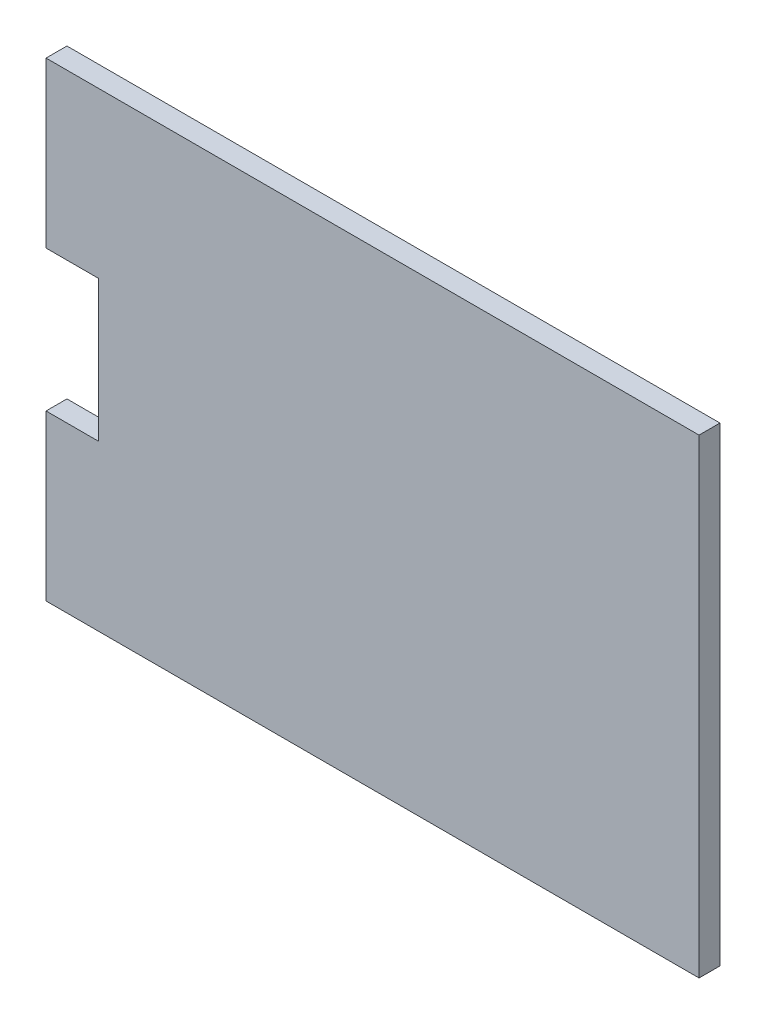
ISO-10303-21;
HEADER;
FILE_DESCRIPTION(('STEP AP214'),'2;1');
FILE_NAME('part.step','',(''),(''),'','','');
FILE_SCHEMA(('AUTOMOTIVE_DESIGN { 1 0 10303 214 1 1 1 1 }'));
ENDSEC;
DATA;
#1=APPLICATION_CONTEXT('core data for automotive mechanical design processes');
#2=APPLICATION_PROTOCOL_DEFINITION('international standard','automotive_design',2000,#1);
#3=PRODUCT_CONTEXT('',#1,'mechanical');
#4=PRODUCT('Part','Part','',(#3));
#5=PRODUCT_RELATED_PRODUCT_CATEGORY('part','',(#4));
#6=PRODUCT_DEFINITION_FORMATION('','',#4);
#7=PRODUCT_DEFINITION_CONTEXT('part definition',#1,'design');
#8=PRODUCT_DEFINITION('design','',#6,#7);
#9=PRODUCT_DEFINITION_SHAPE('','',#8);
#10=(LENGTH_UNIT() NAMED_UNIT(*) SI_UNIT(.MILLI.,.METRE.));
#11=(NAMED_UNIT(*) PLANE_ANGLE_UNIT() SI_UNIT($,.RADIAN.));
#12=(NAMED_UNIT(*) SI_UNIT($,.STERADIAN.) SOLID_ANGLE_UNIT());
#13=UNCERTAINTY_MEASURE_WITH_UNIT(LENGTH_MEASURE(1.E-05),#10,'distance_accuracy_value','');
#14=(GEOMETRIC_REPRESENTATION_CONTEXT(3) GLOBAL_UNCERTAINTY_ASSIGNED_CONTEXT((#13)) GLOBAL_UNIT_ASSIGNED_CONTEXT((#10,
#11,#12)) REPRESENTATION_CONTEXT('',''));
#15=CARTESIAN_POINT('',(0.,0.,0.));
#16=DIRECTION('',(0.,0.,1.));
#17=DIRECTION('',(1.,0.,0.));
#18=AXIS2_PLACEMENT_3D('',#15,#16,#17);
#19=CARTESIAN_POINT('',(-127.658261339093,89.0868250539957,8.));
#20=DIRECTION('',(1.,0.,0.));
#21=DIRECTION('',(0.,0.,-1.));
#22=AXIS2_PLACEMENT_3D('',#19,#20,#21);
#23=PLANE('',#22);
#24=DIRECTION('',(0.,-1.,0.));
#25=VECTOR('',#24,1.);
#26=CARTESIAN_POINT('',(-127.658261339093,89.0868250539957,0.));
#27=LINE('',#26,#25);
#28=CARTESIAN_POINT('',(-127.658261339093,89.0868250539957,0.));
#29=VERTEX_POINT('',#28);
#30=CARTESIAN_POINT('',(-127.658261339093,26.0868250539957,0.));
#31=VERTEX_POINT('',#30);
#32=EDGE_CURVE('E136',#29,#31,#27,.T.);
#33=ORIENTED_EDGE('',*,*,#32,.T.);
#34=DIRECTION('',(0.,0.,1.));
#35=VECTOR('',#34,1.);
#36=CARTESIAN_POINT('',(-127.658261339093,26.0868250539957,0.));
#37=LINE('',#36,#35);
#38=CARTESIAN_POINT('',(-127.658261339093,26.0868250539957,8.));
#39=VERTEX_POINT('',#38);
#40=EDGE_CURVE('E137',#31,#39,#37,.T.);
#41=ORIENTED_EDGE('',*,*,#40,.T.);
#42=DIRECTION('',(0.,-1.,0.));
#43=VECTOR('',#42,1.);
#44=CARTESIAN_POINT('',(-127.658261339093,89.0868250539957,8.));
#45=LINE('',#44,#43);
#46=CARTESIAN_POINT('',(-127.658261339093,89.0868250539957,8.));
#47=VERTEX_POINT('',#46);
#48=EDGE_CURVE('E174',#47,#39,#45,.T.);
#49=ORIENTED_EDGE('',*,*,#48,.F.);
#50=DIRECTION('',(0.,0.,-1.));
#51=VECTOR('',#50,1.);
#52=CARTESIAN_POINT('',(-127.658261339093,89.0868250539957,8.));
#53=LINE('',#52,#51);
#54=EDGE_CURVE('E155',#47,#29,#53,.T.);
#55=ORIENTED_EDGE('',*,*,#54,.T.);
#56=EDGE_LOOP('',(#33,#41,#49,#55));
#57=FACE_BOUND('',#56,.T.);
#58=ADVANCED_FACE('F39',(#57),#23,.F.);
#59=CARTESIAN_POINT('',(-127.658261339093,-27.9131749460043,8.));
#60=VERTEX_POINT('',#59);
#61=CARTESIAN_POINT('',(-127.658261339093,-90.9131749460043,8.));
#62=VERTEX_POINT('',#61);
#63=EDGE_CURVE('E92',#60,#62,#45,.T.);
#64=ORIENTED_EDGE('',*,*,#63,.F.);
#65=DIRECTION('',(0.,0.,1.));
#66=VECTOR('',#65,1.);
#67=CARTESIAN_POINT('',(-127.658261339093,-27.9131749460043,0.));
#68=LINE('',#67,#66);
#69=CARTESIAN_POINT('',(-127.658261339093,-27.9131749460043,0.));
#70=VERTEX_POINT('',#69);
#71=EDGE_CURVE('E118',#70,#60,#68,.T.);
#72=ORIENTED_EDGE('',*,*,#71,.F.);
#73=CARTESIAN_POINT('',(-127.658261339093,-90.9131749460043,0.));
#74=VERTEX_POINT('',#73);
#75=EDGE_CURVE('E127',#70,#74,#27,.T.);
#76=ORIENTED_EDGE('',*,*,#75,.T.);
#77=DIRECTION('',(0.,0.,-1.));
#78=VECTOR('',#77,1.);
#79=CARTESIAN_POINT('',(-127.658261339093,-90.9131749460043,8.));
#80=LINE('',#79,#78);
#81=EDGE_CURVE('E11',#62,#74,#80,.T.);
#82=ORIENTED_EDGE('',*,*,#81,.F.);
#83=EDGE_LOOP('',(#64,#72,#76,#82));
#84=FACE_BOUND('',#83,.T.);
#85=ADVANCED_FACE('F41',(#84),#23,.F.);
#86=CARTESIAN_POINT('',(-127.658261339093,-90.9131749460043,8.));
#87=DIRECTION('',(0.,1.,0.));
#88=DIRECTION('',(0.,0.,1.));
#89=AXIS2_PLACEMENT_3D('',#86,#87,#88);
#90=PLANE('',#89);
#91=DIRECTION('',(1.,0.,0.));
#92=VECTOR('',#91,1.);
#93=CARTESIAN_POINT('',(-127.658261339093,-90.9131749460043,0.));
#94=LINE('',#93,#92);
#95=CARTESIAN_POINT('',(122.341738660907,-90.9131749460043,0.));
#96=VERTEX_POINT('',#95);
#97=EDGE_CURVE('E134',#74,#96,#94,.T.);
#98=ORIENTED_EDGE('',*,*,#97,.T.);
#99=DIRECTION('',(0.,0.,-1.));
#100=VECTOR('',#99,1.);
#101=CARTESIAN_POINT('',(122.341738660907,-90.9131749460043,8.));
#102=LINE('',#101,#100);
#103=CARTESIAN_POINT('',(122.341738660907,-90.9131749460043,8.));
#104=VERTEX_POINT('',#103);
#105=EDGE_CURVE('E48',#104,#96,#102,.T.);
#106=ORIENTED_EDGE('',*,*,#105,.F.);
#107=DIRECTION('',(1.,0.,0.));
#108=VECTOR('',#107,1.);
#109=CARTESIAN_POINT('',(-127.658261339093,-90.9131749460043,8.));
#110=LINE('',#109,#108);
#111=EDGE_CURVE('E178',#62,#104,#110,.T.);
#112=ORIENTED_EDGE('',*,*,#111,.F.);
#113=ORIENTED_EDGE('',*,*,#81,.T.);
#114=EDGE_LOOP('',(#98,#106,#112,#113));
#115=FACE_BOUND('',#114,.T.);
#116=ADVANCED_FACE('F218',(#115),#90,.F.);
#117=CARTESIAN_POINT('',(122.341738660907,89.0868250539957,8.));
#118=DIRECTION('',(-1.,0.,0.));
#119=DIRECTION('',(0.,-1.,0.));
#120=AXIS2_PLACEMENT_3D('',#117,#118,#119);
#121=PLANE('',#120);
#122=DIRECTION('',(0.,1.,0.));
#123=VECTOR('',#122,1.);
#124=CARTESIAN_POINT('',(122.341738660907,89.0868250539957,0.));
#125=LINE('',#124,#123);
#126=CARTESIAN_POINT('',(122.341738660907,89.0868250539957,0.));
#127=VERTEX_POINT('',#126);
#128=EDGE_CURVE('E150',#96,#127,#125,.T.);
#129=ORIENTED_EDGE('',*,*,#128,.T.);
#130=DIRECTION('',(0.,0.,-1.));
#131=VECTOR('',#130,1.);
#132=CARTESIAN_POINT('',(122.341738660907,89.0868250539957,8.));
#133=LINE('',#132,#131);
#134=CARTESIAN_POINT('',(122.341738660907,89.0868250539957,8.));
#135=VERTEX_POINT('',#134);
#136=EDGE_CURVE('E158',#135,#127,#133,.T.);
#137=ORIENTED_EDGE('',*,*,#136,.F.);
#138=DIRECTION('',(0.,1.,0.));
#139=VECTOR('',#138,1.);
#140=CARTESIAN_POINT('',(122.341738660907,89.0868250539957,8.));
#141=LINE('',#140,#139);
#142=EDGE_CURVE('E167',#104,#135,#141,.T.);
#143=ORIENTED_EDGE('',*,*,#142,.F.);
#144=ORIENTED_EDGE('',*,*,#105,.T.);
#145=EDGE_LOOP('',(#129,#137,#143,#144));
#146=FACE_BOUND('',#145,.T.);
#147=ADVANCED_FACE('F165',(#146),#121,.F.);
#148=CARTESIAN_POINT('',(-127.658261339093,89.0868250539957,8.));
#149=DIRECTION('',(0.,-1.,0.));
#150=DIRECTION('',(0.,0.,-1.));
#151=AXIS2_PLACEMENT_3D('',#148,#149,#150);
#152=PLANE('',#151);
#153=DIRECTION('',(-1.,0.,0.));
#154=VECTOR('',#153,1.);
#155=CARTESIAN_POINT('',(-127.658261339093,89.0868250539957,0.));
#156=LINE('',#155,#154);
#157=EDGE_CURVE('E85',#127,#29,#156,.T.);
#158=ORIENTED_EDGE('',*,*,#157,.T.);
#159=ORIENTED_EDGE('',*,*,#54,.F.);
#160=DIRECTION('',(-1.,0.,0.));
#161=VECTOR('',#160,1.);
#162=CARTESIAN_POINT('',(-127.658261339093,89.0868250539957,8.));
#163=LINE('',#162,#161);
#164=EDGE_CURVE('E64',#135,#47,#163,.T.);
#165=ORIENTED_EDGE('',*,*,#164,.F.);
#166=ORIENTED_EDGE('',*,*,#136,.T.);
#167=EDGE_LOOP('',(#158,#159,#165,#166));
#168=FACE_BOUND('',#167,.T.);
#169=ADVANCED_FACE('F175',(#168),#152,.F.);
#170=CARTESIAN_POINT('',(0.,0.,8.));
#171=DIRECTION('',(0.,0.,1.));
#172=DIRECTION('',(1.,0.,0.));
#173=AXIS2_PLACEMENT_3D('',#170,#171,#172);
#174=PLANE('',#173);
#175=DIRECTION('',(-1.,0.,0.));
#176=VECTOR('',#175,1.);
#177=CARTESIAN_POINT('',(-127.658261339093,26.0868250539957,8.));
#178=LINE('',#177,#176);
#179=CARTESIAN_POINT('',(-107.658261339093,26.0868250539957,8.));
#180=VERTEX_POINT('',#179);
#181=EDGE_CURVE('E123',#180,#39,#178,.T.);
#182=ORIENTED_EDGE('',*,*,#181,.F.);
#183=DIRECTION('',(0.,1.,0.));
#184=VECTOR('',#183,1.);
#185=CARTESIAN_POINT('',(-107.658261339093,26.0868250539957,8.));
#186=LINE('',#185,#184);
#187=CARTESIAN_POINT('',(-107.658261339093,-27.9131749460043,8.));
#188=VERTEX_POINT('',#187);
#189=EDGE_CURVE('E190',#188,#180,#186,.T.);
#190=ORIENTED_EDGE('',*,*,#189,.F.);
#191=DIRECTION('',(1.,0.,0.));
#192=VECTOR('',#191,1.);
#193=CARTESIAN_POINT('',(-127.658261339093,-27.9131749460043,8.));
#194=LINE('',#193,#192);
#195=EDGE_CURVE('E194',#60,#188,#194,.T.);
#196=ORIENTED_EDGE('',*,*,#195,.F.);
#197=ORIENTED_EDGE('',*,*,#63,.T.);
#198=ORIENTED_EDGE('',*,*,#111,.T.);
#199=ORIENTED_EDGE('',*,*,#142,.T.);
#200=ORIENTED_EDGE('',*,*,#164,.T.);
#201=ORIENTED_EDGE('',*,*,#48,.T.);
#202=EDGE_LOOP('',(#182,#190,#196,#197,#198,#199,#200,#201));
#203=FACE_BOUND('',#202,.T.);
#204=ADVANCED_FACE('F202',(#203),#174,.T.);
#205=CARTESIAN_POINT('',(0.,0.,0.));
#206=DIRECTION('',(0.,0.,1.));
#207=DIRECTION('',(1.,0.,0.));
#208=AXIS2_PLACEMENT_3D('',#205,#206,#207);
#209=PLANE('',#208);
#210=DIRECTION('',(0.,1.,0.));
#211=VECTOR('',#210,1.);
#212=CARTESIAN_POINT('',(-107.658261339093,26.0868250539957,0.));
#213=LINE('',#212,#211);
#214=CARTESIAN_POINT('',(-107.658261339093,-27.9131749460043,0.));
#215=VERTEX_POINT('',#214);
#216=CARTESIAN_POINT('',(-107.658261339093,26.0868250539957,0.));
#217=VERTEX_POINT('',#216);
#218=EDGE_CURVE('E55',#215,#217,#213,.T.);
#219=ORIENTED_EDGE('',*,*,#218,.T.);
#220=DIRECTION('',(-1.,0.,0.));
#221=VECTOR('',#220,1.);
#222=CARTESIAN_POINT('',(-127.658261339093,26.0868250539957,0.));
#223=LINE('',#222,#221);
#224=EDGE_CURVE('E130',#217,#31,#223,.T.);
#225=ORIENTED_EDGE('',*,*,#224,.T.);
#226=ORIENTED_EDGE('',*,*,#32,.F.);
#227=ORIENTED_EDGE('',*,*,#157,.F.);
#228=ORIENTED_EDGE('',*,*,#128,.F.);
#229=ORIENTED_EDGE('',*,*,#97,.F.);
#230=ORIENTED_EDGE('',*,*,#75,.F.);
#231=DIRECTION('',(1.,0.,0.));
#232=VECTOR('',#231,1.);
#233=CARTESIAN_POINT('',(-127.658261339093,-27.9131749460043,0.));
#234=LINE('',#233,#232);
#235=EDGE_CURVE('E114',#70,#215,#234,.T.);
#236=ORIENTED_EDGE('',*,*,#235,.T.);
#237=EDGE_LOOP('',(#219,#225,#226,#227,#228,#229,#230,#236));
#238=FACE_BOUND('',#237,.T.);
#239=ADVANCED_FACE('F132',(#238),#209,.F.);
#240=CARTESIAN_POINT('',(-127.658261339093,26.0868250539957,0.));
#241=DIRECTION('',(0.,1.,0.));
#242=DIRECTION('',(0.,0.,1.));
#243=AXIS2_PLACEMENT_3D('',#240,#241,#242);
#244=PLANE('',#243);
#245=ORIENTED_EDGE('',*,*,#181,.T.);
#246=ORIENTED_EDGE('',*,*,#40,.F.);
#247=ORIENTED_EDGE('',*,*,#224,.F.);
#248=DIRECTION('',(0.,0.,1.));
#249=VECTOR('',#248,1.);
#250=CARTESIAN_POINT('',(-107.658261339093,26.0868250539957,0.));
#251=LINE('',#250,#249);
#252=EDGE_CURVE('E143',#217,#180,#251,.T.);
#253=ORIENTED_EDGE('',*,*,#252,.T.);
#254=EDGE_LOOP('',(#245,#246,#247,#253));
#255=FACE_BOUND('',#254,.T.);
#256=ADVANCED_FACE('F205',(#255),#244,.F.);
#257=CARTESIAN_POINT('',(-107.658261339093,26.0868250539957,0.));
#258=DIRECTION('',(1.,0.,0.));
#259=DIRECTION('',(0.,0.,-1.));
#260=AXIS2_PLACEMENT_3D('',#257,#258,#259);
#261=PLANE('',#260);
#262=ORIENTED_EDGE('',*,*,#189,.T.);
#263=ORIENTED_EDGE('',*,*,#252,.F.);
#264=ORIENTED_EDGE('',*,*,#218,.F.);
#265=DIRECTION('',(0.,0.,1.));
#266=VECTOR('',#265,1.);
#267=CARTESIAN_POINT('',(-107.658261339093,-27.9131749460043,0.));
#268=LINE('',#267,#266);
#269=EDGE_CURVE('E119',#215,#188,#268,.T.);
#270=ORIENTED_EDGE('',*,*,#269,.T.);
#271=EDGE_LOOP('',(#262,#263,#264,#270));
#272=FACE_BOUND('',#271,.T.);
#273=ADVANCED_FACE('F203',(#272),#261,.F.);
#274=CARTESIAN_POINT('',(-127.658261339093,-27.9131749460043,0.));
#275=DIRECTION('',(0.,-1.,0.));
#276=DIRECTION('',(1.,0.,0.));
#277=AXIS2_PLACEMENT_3D('',#274,#275,#276);
#278=PLANE('',#277);
#279=ORIENTED_EDGE('',*,*,#195,.T.);
#280=ORIENTED_EDGE('',*,*,#269,.F.);
#281=ORIENTED_EDGE('',*,*,#235,.F.);
#282=ORIENTED_EDGE('',*,*,#71,.T.);
#283=EDGE_LOOP('',(#279,#280,#281,#282));
#284=FACE_BOUND('',#283,.T.);
#285=ADVANCED_FACE('F117',(#284),#278,.F.);
#286=CLOSED_SHELL('',(#58,#85,#116,#147,#169,#204,#239,#256,#273,#285));
#287=MANIFOLD_SOLID_BREP('B2',#286);
#288=ADVANCED_BREP_SHAPE_REPRESENTATION('',(#18,#287),#14);
#289=SHAPE_DEFINITION_REPRESENTATION(#9,#288);
ENDSEC;
END-ISO-10303-21;
